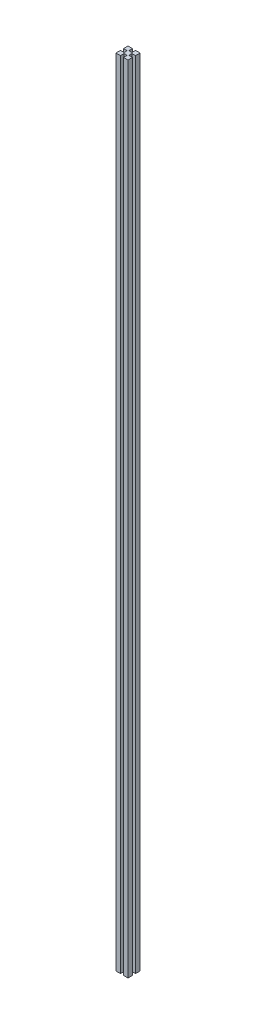
ISO-10303-21;
HEADER;
FILE_DESCRIPTION(('STEP AP214'),'2;1');
FILE_NAME('part.step','',(''),(''),'','','');
FILE_SCHEMA(('AUTOMOTIVE_DESIGN { 1 0 10303 214 1 1 1 1 }'));
ENDSEC;
DATA;
#1=APPLICATION_CONTEXT('core data for automotive mechanical design processes');
#2=APPLICATION_PROTOCOL_DEFINITION('international standard','automotive_design',2000,#1);
#3=PRODUCT_CONTEXT('',#1,'mechanical');
#4=PRODUCT('Part','Part','',(#3));
#5=PRODUCT_RELATED_PRODUCT_CATEGORY('part','',(#4));
#6=PRODUCT_DEFINITION_FORMATION('','',#4);
#7=PRODUCT_DEFINITION_CONTEXT('part definition',#1,'design');
#8=PRODUCT_DEFINITION('design','',#6,#7);
#9=PRODUCT_DEFINITION_SHAPE('','',#8);
#10=(LENGTH_UNIT() NAMED_UNIT(*) SI_UNIT(.MILLI.,.METRE.));
#11=(NAMED_UNIT(*) PLANE_ANGLE_UNIT() SI_UNIT($,.RADIAN.));
#12=(NAMED_UNIT(*) SI_UNIT($,.STERADIAN.) SOLID_ANGLE_UNIT());
#13=UNCERTAINTY_MEASURE_WITH_UNIT(LENGTH_MEASURE(1.E-05),#10,'distance_accuracy_value','');
#14=(GEOMETRIC_REPRESENTATION_CONTEXT(3) GLOBAL_UNCERTAINTY_ASSIGNED_CONTEXT((#13)) GLOBAL_UNIT_ASSIGNED_CONTEXT((#10,
#11,#12)) REPRESENTATION_CONTEXT('',''));
#15=CARTESIAN_POINT('',(0.,0.,0.));
#16=DIRECTION('',(0.,0.,1.));
#17=DIRECTION('',(1.,0.,0.));
#18=AXIS2_PLACEMENT_3D('',#15,#16,#17);
#19=CARTESIAN_POINT('',(10.,-656.463,10.));
#20=DIRECTION('',(1.,0.,0.));
#21=DIRECTION('',(0.,0.,-1.));
#22=AXIS2_PLACEMENT_3D('',#19,#20,#21);
#23=PLANE('',#22);
#24=DIRECTION('',(0.,-1.,0.));
#25=VECTOR('',#24,1.);
#26=CARTESIAN_POINT('',(10.,-656.463,2.5));
#27=LINE('',#26,#25);
#28=CARTESIAN_POINT('',(10.,656.463,2.5));
#29=VERTEX_POINT('',#28);
#30=CARTESIAN_POINT('',(10.,-656.463,2.5));
#31=VERTEX_POINT('',#30);
#32=EDGE_CURVE('E265',#29,#31,#27,.T.);
#33=ORIENTED_EDGE('',*,*,#32,.F.);
#34=DIRECTION('',(0.,0.,-1.));
#35=VECTOR('',#34,1.);
#36=CARTESIAN_POINT('',(10.,656.463,10.));
#37=LINE('',#36,#35);
#38=CARTESIAN_POINT('',(10.,656.463,10.));
#39=VERTEX_POINT('',#38);
#40=EDGE_CURVE('E271',#39,#29,#37,.T.);
#41=ORIENTED_EDGE('',*,*,#40,.F.);
#42=DIRECTION('',(0.,1.,0.));
#43=VECTOR('',#42,1.);
#44=CARTESIAN_POINT('',(10.,-656.463,10.));
#45=LINE('',#44,#43);
#46=CARTESIAN_POINT('',(10.,-656.463,10.));
#47=VERTEX_POINT('',#46);
#48=EDGE_CURVE('E302',#47,#39,#45,.T.);
#49=ORIENTED_EDGE('',*,*,#48,.F.);
#50=DIRECTION('',(0.,0.,-1.));
#51=VECTOR('',#50,1.);
#52=CARTESIAN_POINT('',(10.,-656.463,10.));
#53=LINE('',#52,#51);
#54=EDGE_CURVE('E286',#47,#31,#53,.T.);
#55=ORIENTED_EDGE('',*,*,#54,.T.);
#56=EDGE_LOOP('',(#33,#41,#49,#55));
#57=FACE_BOUND('',#56,.T.);
#58=ADVANCED_FACE('F34',(#57),#23,.T.);
#59=CARTESIAN_POINT('',(-10.,-656.463,10.));
#60=DIRECTION('',(0.,0.,1.));
#61=DIRECTION('',(1.,0.,0.));
#62=AXIS2_PLACEMENT_3D('',#59,#60,#61);
#63=PLANE('',#62);
#64=DIRECTION('',(0.,1.,0.));
#65=VECTOR('',#64,1.);
#66=CARTESIAN_POINT('',(2.5,-656.463,10.));
#67=LINE('',#66,#65);
#68=CARTESIAN_POINT('',(2.5,-656.463,10.));
#69=VERTEX_POINT('',#68);
#70=CARTESIAN_POINT('',(2.5,656.463,10.));
#71=VERTEX_POINT('',#70);
#72=EDGE_CURVE('E258',#69,#71,#67,.T.);
#73=ORIENTED_EDGE('',*,*,#72,.F.);
#74=DIRECTION('',(1.,0.,0.));
#75=VECTOR('',#74,1.);
#76=CARTESIAN_POINT('',(-10.,-656.463,10.));
#77=LINE('',#76,#75);
#78=EDGE_CURVE('E297',#69,#47,#77,.T.);
#79=ORIENTED_EDGE('',*,*,#78,.T.);
#80=ORIENTED_EDGE('',*,*,#48,.T.);
#81=DIRECTION('',(1.,0.,0.));
#82=VECTOR('',#81,1.);
#83=CARTESIAN_POINT('',(-10.,656.463,10.));
#84=LINE('',#83,#82);
#85=EDGE_CURVE('E281',#71,#39,#84,.T.);
#86=ORIENTED_EDGE('',*,*,#85,.F.);
#87=EDGE_LOOP('',(#73,#79,#80,#86));
#88=FACE_BOUND('',#87,.T.);
#89=ADVANCED_FACE('F376',(#88),#63,.T.);
#90=CARTESIAN_POINT('',(-10.,-656.463,10.));
#91=DIRECTION('',(-1.,0.,0.));
#92=DIRECTION('',(0.,0.,1.));
#93=AXIS2_PLACEMENT_3D('',#90,#91,#92);
#94=PLANE('',#93);
#95=DIRECTION('',(0.,-1.,0.));
#96=VECTOR('',#95,1.);
#97=CARTESIAN_POINT('',(-10.,-656.463,-2.5));
#98=LINE('',#97,#96);
#99=CARTESIAN_POINT('',(-10.,656.463,-2.5));
#100=VERTEX_POINT('',#99);
#101=CARTESIAN_POINT('',(-10.,-656.463,-2.5));
#102=VERTEX_POINT('',#101);
#103=EDGE_CURVE('E261',#100,#102,#98,.T.);
#104=ORIENTED_EDGE('',*,*,#103,.F.);
#105=DIRECTION('',(0.,0.,1.));
#106=VECTOR('',#105,1.);
#107=CARTESIAN_POINT('',(-10.,656.463,10.));
#108=LINE('',#107,#106);
#109=CARTESIAN_POINT('',(-10.,656.463,-10.));
#110=VERTEX_POINT('',#109);
#111=EDGE_CURVE('E278',#110,#100,#108,.T.);
#112=ORIENTED_EDGE('',*,*,#111,.F.);
#113=DIRECTION('',(0.,1.,0.));
#114=VECTOR('',#113,1.);
#115=CARTESIAN_POINT('',(-10.,-656.463,-10.));
#116=LINE('',#115,#114);
#117=CARTESIAN_POINT('',(-10.,-656.463,-10.));
#118=VERTEX_POINT('',#117);
#119=EDGE_CURVE('E309',#118,#110,#116,.T.);
#120=ORIENTED_EDGE('',*,*,#119,.F.);
#121=DIRECTION('',(0.,0.,1.));
#122=VECTOR('',#121,1.);
#123=CARTESIAN_POINT('',(-10.,-656.463,10.));
#124=LINE('',#123,#122);
#125=EDGE_CURVE('E294',#118,#102,#124,.T.);
#126=ORIENTED_EDGE('',*,*,#125,.T.);
#127=EDGE_LOOP('',(#104,#112,#120,#126));
#128=FACE_BOUND('',#127,.T.);
#129=ADVANCED_FACE('F346',(#128),#94,.T.);
#130=CARTESIAN_POINT('',(-10.,-656.463,-10.));
#131=DIRECTION('',(0.,0.,-1.));
#132=DIRECTION('',(-1.,0.,0.));
#133=AXIS2_PLACEMENT_3D('',#130,#131,#132);
#134=PLANE('',#133);
#135=DIRECTION('',(0.,-1.,0.));
#136=VECTOR('',#135,1.);
#137=CARTESIAN_POINT('',(2.5,-656.463,-10.));
#138=LINE('',#137,#136);
#139=CARTESIAN_POINT('',(2.5,656.463,-10.));
#140=VERTEX_POINT('',#139);
#141=CARTESIAN_POINT('',(2.5,-656.463,-10.));
#142=VERTEX_POINT('',#141);
#143=EDGE_CURVE('E268',#140,#142,#138,.T.);
#144=ORIENTED_EDGE('',*,*,#143,.F.);
#145=DIRECTION('',(-1.,0.,0.));
#146=VECTOR('',#145,1.);
#147=CARTESIAN_POINT('',(-10.,656.463,-10.));
#148=LINE('',#147,#146);
#149=CARTESIAN_POINT('',(10.,656.463,-10.));
#150=VERTEX_POINT('',#149);
#151=EDGE_CURVE('E275',#150,#140,#148,.T.);
#152=ORIENTED_EDGE('',*,*,#151,.F.);
#153=DIRECTION('',(0.,1.,0.));
#154=VECTOR('',#153,1.);
#155=CARTESIAN_POINT('',(10.,-656.463,-10.));
#156=LINE('',#155,#154);
#157=CARTESIAN_POINT('',(10.,-656.463,-10.));
#158=VERTEX_POINT('',#157);
#159=EDGE_CURVE('E301',#158,#150,#156,.T.);
#160=ORIENTED_EDGE('',*,*,#159,.F.);
#161=DIRECTION('',(-1.,0.,0.));
#162=VECTOR('',#161,1.);
#163=CARTESIAN_POINT('',(-10.,-656.463,-10.));
#164=LINE('',#163,#162);
#165=EDGE_CURVE('E290',#158,#142,#164,.T.);
#166=ORIENTED_EDGE('',*,*,#165,.T.);
#167=EDGE_LOOP('',(#144,#152,#160,#166));
#168=FACE_BOUND('',#167,.T.);
#169=ADVANCED_FACE('F330',(#168),#134,.T.);
#170=DIRECTION('',(0.,1.,0.));
#171=VECTOR('',#170,1.);
#172=CARTESIAN_POINT('',(10.,-656.463,-2.5));
#173=LINE('',#172,#171);
#174=CARTESIAN_POINT('',(10.,-656.463,-2.5));
#175=VERTEX_POINT('',#174);
#176=CARTESIAN_POINT('',(10.,656.463,-2.5));
#177=VERTEX_POINT('',#176);
#178=EDGE_CURVE('E263',#175,#177,#173,.T.);
#179=ORIENTED_EDGE('',*,*,#178,.F.);
#180=EDGE_CURVE('E285',#175,#158,#53,.T.);
#181=ORIENTED_EDGE('',*,*,#180,.T.);
#182=ORIENTED_EDGE('',*,*,#159,.T.);
#183=EDGE_CURVE('E270',#177,#150,#37,.T.);
#184=ORIENTED_EDGE('',*,*,#183,.F.);
#185=EDGE_LOOP('',(#179,#181,#182,#184));
#186=FACE_BOUND('',#185,.T.);
#187=ADVANCED_FACE('F36',(#186),#23,.T.);
#188=DIRECTION('',(0.,-1.,0.));
#189=VECTOR('',#188,1.);
#190=CARTESIAN_POINT('',(-2.5,-656.463,10.));
#191=LINE('',#190,#189);
#192=CARTESIAN_POINT('',(-2.5,656.463,10.));
#193=VERTEX_POINT('',#192);
#194=CARTESIAN_POINT('',(-2.5,-656.463,10.));
#195=VERTEX_POINT('',#194);
#196=EDGE_CURVE('E202',#193,#195,#191,.T.);
#197=ORIENTED_EDGE('',*,*,#196,.F.);
#198=CARTESIAN_POINT('',(-10.,656.463,10.));
#199=VERTEX_POINT('',#198);
#200=EDGE_CURVE('E282',#199,#193,#84,.T.);
#201=ORIENTED_EDGE('',*,*,#200,.F.);
#202=DIRECTION('',(0.,1.,0.));
#203=VECTOR('',#202,1.);
#204=CARTESIAN_POINT('',(-10.,-656.463,10.));
#205=LINE('',#204,#203);
#206=CARTESIAN_POINT('',(-10.,-656.463,10.));
#207=VERTEX_POINT('',#206);
#208=EDGE_CURVE('E306',#207,#199,#205,.T.);
#209=ORIENTED_EDGE('',*,*,#208,.F.);
#210=EDGE_CURVE('E298',#207,#195,#77,.T.);
#211=ORIENTED_EDGE('',*,*,#210,.T.);
#212=EDGE_LOOP('',(#197,#201,#209,#211));
#213=FACE_BOUND('',#212,.T.);
#214=ADVANCED_FACE('F362',(#213),#63,.T.);
#215=DIRECTION('',(0.,1.,0.));
#216=VECTOR('',#215,1.);
#217=CARTESIAN_POINT('',(-10.,-656.463,2.5));
#218=LINE('',#217,#216);
#219=CARTESIAN_POINT('',(-10.,-656.463,2.5));
#220=VERTEX_POINT('',#219);
#221=CARTESIAN_POINT('',(-10.,656.463,2.5));
#222=VERTEX_POINT('',#221);
#223=EDGE_CURVE('E57',#220,#222,#218,.T.);
#224=ORIENTED_EDGE('',*,*,#223,.F.);
#225=EDGE_CURVE('E293',#220,#207,#124,.T.);
#226=ORIENTED_EDGE('',*,*,#225,.T.);
#227=ORIENTED_EDGE('',*,*,#208,.T.);
#228=EDGE_CURVE('E277',#222,#199,#108,.T.);
#229=ORIENTED_EDGE('',*,*,#228,.F.);
#230=EDGE_LOOP('',(#224,#226,#227,#229));
#231=FACE_BOUND('',#230,.T.);
#232=ADVANCED_FACE('F356',(#231),#94,.T.);
#233=DIRECTION('',(0.,1.,0.));
#234=VECTOR('',#233,1.);
#235=CARTESIAN_POINT('',(-2.5,-656.463,-10.));
#236=LINE('',#235,#234);
#237=CARTESIAN_POINT('',(-2.5,-656.463,-10.));
#238=VERTEX_POINT('',#237);
#239=CARTESIAN_POINT('',(-2.5,656.463,-10.));
#240=VERTEX_POINT('',#239);
#241=EDGE_CURVE('E175',#238,#240,#236,.T.);
#242=ORIENTED_EDGE('',*,*,#241,.F.);
#243=EDGE_CURVE('E289',#238,#118,#164,.T.);
#244=ORIENTED_EDGE('',*,*,#243,.T.);
#245=ORIENTED_EDGE('',*,*,#119,.T.);
#246=EDGE_CURVE('E274',#240,#110,#148,.T.);
#247=ORIENTED_EDGE('',*,*,#246,.F.);
#248=EDGE_LOOP('',(#242,#244,#245,#247));
#249=FACE_BOUND('',#248,.T.);
#250=ADVANCED_FACE('F339',(#249),#134,.T.);
#251=CARTESIAN_POINT('',(0.,-656.463,0.));
#252=DIRECTION('',(0.,-1.,0.));
#253=DIRECTION('',(0.,0.,-1.));
#254=AXIS2_PLACEMENT_3D('',#251,#252,#253);
#255=PLANE('',#254);
#256=DIRECTION('',(0.,0.,-1.));
#257=VECTOR('',#256,1.);
#258=CARTESIAN_POINT('',(2.5,-656.463,-4.00000000000001));
#259=LINE('',#258,#257);
#260=CARTESIAN_POINT('',(2.5,-656.463,-4.00000000000001));
#261=VERTEX_POINT('',#260);
#262=EDGE_CURVE('E192',#261,#142,#259,.T.);
#263=ORIENTED_EDGE('',*,*,#262,.T.);
#264=ORIENTED_EDGE('',*,*,#165,.F.);
#265=ORIENTED_EDGE('',*,*,#180,.F.);
#266=DIRECTION('',(-1.,0.,0.));
#267=VECTOR('',#266,1.);
#268=CARTESIAN_POINT('',(4.,-656.463,-2.5));
#269=LINE('',#268,#267);
#270=CARTESIAN_POINT('',(4.,-656.463,-2.5));
#271=VERTEX_POINT('',#270);
#272=EDGE_CURVE('E210',#175,#271,#269,.T.);
#273=ORIENTED_EDGE('',*,*,#272,.T.);
#274=DIRECTION('',(0.,0.,1.));
#275=VECTOR('',#274,1.);
#276=CARTESIAN_POINT('',(4.,-656.463,-2.5));
#277=LINE('',#276,#275);
#278=CARTESIAN_POINT('',(4.,-656.463,2.5));
#279=VERTEX_POINT('',#278);
#280=EDGE_CURVE('E213',#271,#279,#277,.T.);
#281=ORIENTED_EDGE('',*,*,#280,.T.);
#282=DIRECTION('',(1.,0.,0.));
#283=VECTOR('',#282,1.);
#284=CARTESIAN_POINT('',(4.,-656.463,2.5));
#285=LINE('',#284,#283);
#286=EDGE_CURVE('E216',#279,#31,#285,.T.);
#287=ORIENTED_EDGE('',*,*,#286,.T.);
#288=ORIENTED_EDGE('',*,*,#54,.F.);
#289=ORIENTED_EDGE('',*,*,#78,.F.);
#290=DIRECTION('',(0.,0.,-1.));
#291=VECTOR('',#290,1.);
#292=CARTESIAN_POINT('',(2.5,-656.463,4.));
#293=LINE('',#292,#291);
#294=CARTESIAN_POINT('',(2.5,-656.463,4.));
#295=VERTEX_POINT('',#294);
#296=EDGE_CURVE('E251',#69,#295,#293,.T.);
#297=ORIENTED_EDGE('',*,*,#296,.T.);
#298=DIRECTION('',(-1.,0.,0.));
#299=VECTOR('',#298,1.);
#300=CARTESIAN_POINT('',(-2.5,-656.463,4.));
#301=LINE('',#300,#299);
#302=CARTESIAN_POINT('',(-2.5,-656.463,4.));
#303=VERTEX_POINT('',#302);
#304=EDGE_CURVE('E245',#295,#303,#301,.T.);
#305=ORIENTED_EDGE('',*,*,#304,.T.);
#306=DIRECTION('',(0.,0.,1.));
#307=VECTOR('',#306,1.);
#308=CARTESIAN_POINT('',(-2.5,-656.463,4.));
#309=LINE('',#308,#307);
#310=EDGE_CURVE('E248',#303,#195,#309,.T.);
#311=ORIENTED_EDGE('',*,*,#310,.T.);
#312=ORIENTED_EDGE('',*,*,#210,.F.);
#313=ORIENTED_EDGE('',*,*,#225,.F.);
#314=DIRECTION('',(1.,0.,0.));
#315=VECTOR('',#314,1.);
#316=CARTESIAN_POINT('',(-4.00000000000001,-656.463,2.5));
#317=LINE('',#316,#315);
#318=CARTESIAN_POINT('',(-4.00000000000001,-656.463,2.5));
#319=VERTEX_POINT('',#318);
#320=EDGE_CURVE('E232',#220,#319,#317,.T.);
#321=ORIENTED_EDGE('',*,*,#320,.T.);
#322=DIRECTION('',(0.,0.,-1.));
#323=VECTOR('',#322,1.);
#324=CARTESIAN_POINT('',(-4.00000000000001,-656.463,-2.5));
#325=LINE('',#324,#323);
#326=CARTESIAN_POINT('',(-4.00000000000001,-656.463,-2.5));
#327=VERTEX_POINT('',#326);
#328=EDGE_CURVE('E235',#319,#327,#325,.T.);
#329=ORIENTED_EDGE('',*,*,#328,.T.);
#330=DIRECTION('',(-1.,0.,0.));
#331=VECTOR('',#330,1.);
#332=CARTESIAN_POINT('',(-4.00000000000001,-656.463,-2.5));
#333=LINE('',#332,#331);
#334=EDGE_CURVE('E229',#327,#102,#333,.T.);
#335=ORIENTED_EDGE('',*,*,#334,.T.);
#336=ORIENTED_EDGE('',*,*,#125,.F.);
#337=ORIENTED_EDGE('',*,*,#243,.F.);
#338=DIRECTION('',(0.,0.,1.));
#339=VECTOR('',#338,1.);
#340=CARTESIAN_POINT('',(-2.5,-656.463,-4.00000000000001));
#341=LINE('',#340,#339);
#342=CARTESIAN_POINT('',(-2.5,-656.463,-4.00000000000001));
#343=VERTEX_POINT('',#342);
#344=EDGE_CURVE('E195',#238,#343,#341,.T.);
#345=ORIENTED_EDGE('',*,*,#344,.T.);
#346=DIRECTION('',(1.,0.,0.));
#347=VECTOR('',#346,1.);
#348=CARTESIAN_POINT('',(-2.5,-656.463,-4.00000000000001));
#349=LINE('',#348,#347);
#350=EDGE_CURVE('E185',#343,#261,#349,.T.);
#351=ORIENTED_EDGE('',*,*,#350,.T.);
#352=EDGE_LOOP('',(#263,#264,#265,#273,#281,#287,#288,#289,#297,#305,#311,#312,#313,#321,#329,
#335,#336,#337,#345,#351));
#353=FACE_BOUND('',#352,.T.);
#354=ADVANCED_FACE('F335',(#353),#255,.T.);
#355=CARTESIAN_POINT('',(0.,656.463,0.));
#356=DIRECTION('',(0.,-1.,0.));
#357=DIRECTION('',(0.,0.,-1.));
#358=AXIS2_PLACEMENT_3D('',#355,#356,#357);
#359=PLANE('',#358);
#360=ORIENTED_EDGE('',*,*,#151,.T.);
#361=DIRECTION('',(0.,0.,-1.));
#362=VECTOR('',#361,1.);
#363=CARTESIAN_POINT('',(2.5,656.463,-4.00000000000001));
#364=LINE('',#363,#362);
#365=CARTESIAN_POINT('',(2.5,656.463,-4.00000000000001));
#366=VERTEX_POINT('',#365);
#367=EDGE_CURVE('E191',#366,#140,#364,.T.);
#368=ORIENTED_EDGE('',*,*,#367,.F.);
#369=DIRECTION('',(1.,0.,0.));
#370=VECTOR('',#369,1.);
#371=CARTESIAN_POINT('',(-2.5,656.463,-4.00000000000001));
#372=LINE('',#371,#370);
#373=CARTESIAN_POINT('',(-2.5,656.463,-4.00000000000001));
#374=VERTEX_POINT('',#373);
#375=EDGE_CURVE('E182',#374,#366,#372,.T.);
#376=ORIENTED_EDGE('',*,*,#375,.F.);
#377=DIRECTION('',(0.,0.,-1.));
#378=VECTOR('',#377,1.);
#379=CARTESIAN_POINT('',(-2.5,656.463,0.));
#380=LINE('',#379,#378);
#381=EDGE_CURVE('E11',#374,#240,#380,.T.);
#382=ORIENTED_EDGE('',*,*,#381,.T.);
#383=ORIENTED_EDGE('',*,*,#246,.T.);
#384=ORIENTED_EDGE('',*,*,#111,.T.);
#385=DIRECTION('',(-1.,0.,0.));
#386=VECTOR('',#385,1.);
#387=CARTESIAN_POINT('',(-4.00000000000001,656.463,-2.5));
#388=LINE('',#387,#386);
#389=CARTESIAN_POINT('',(-4.00000000000001,656.463,-2.5));
#390=VERTEX_POINT('',#389);
#391=EDGE_CURVE('E223',#390,#100,#388,.T.);
#392=ORIENTED_EDGE('',*,*,#391,.F.);
#393=DIRECTION('',(0.,0.,-1.));
#394=VECTOR('',#393,1.);
#395=CARTESIAN_POINT('',(-4.00000000000001,656.463,-2.5));
#396=LINE('',#395,#394);
#397=CARTESIAN_POINT('',(-4.00000000000001,656.463,2.5));
#398=VERTEX_POINT('',#397);
#399=EDGE_CURVE('E225',#398,#390,#396,.T.);
#400=ORIENTED_EDGE('',*,*,#399,.F.);
#401=DIRECTION('',(-1.,0.,0.));
#402=VECTOR('',#401,1.);
#403=CARTESIAN_POINT('',(0.,656.463,2.5));
#404=LINE('',#403,#402);
#405=EDGE_CURVE('E316',#398,#222,#404,.T.);
#406=ORIENTED_EDGE('',*,*,#405,.T.);
#407=ORIENTED_EDGE('',*,*,#228,.T.);
#408=ORIENTED_EDGE('',*,*,#200,.T.);
#409=DIRECTION('',(0.,0.,1.));
#410=VECTOR('',#409,1.);
#411=CARTESIAN_POINT('',(-2.5,656.463,4.));
#412=LINE('',#411,#410);
#413=CARTESIAN_POINT('',(-2.5,656.463,4.));
#414=VERTEX_POINT('',#413);
#415=EDGE_CURVE('E243',#414,#193,#412,.T.);
#416=ORIENTED_EDGE('',*,*,#415,.F.);
#417=DIRECTION('',(-1.,0.,0.));
#418=VECTOR('',#417,1.);
#419=CARTESIAN_POINT('',(-2.5,656.463,4.));
#420=LINE('',#419,#418);
#421=CARTESIAN_POINT('',(2.5,656.463,4.));
#422=VERTEX_POINT('',#421);
#423=EDGE_CURVE('E49',#422,#414,#420,.T.);
#424=ORIENTED_EDGE('',*,*,#423,.F.);
#425=DIRECTION('',(0.,0.,1.));
#426=VECTOR('',#425,1.);
#427=CARTESIAN_POINT('',(2.5,656.463,0.));
#428=LINE('',#427,#426);
#429=EDGE_CURVE('E305',#422,#71,#428,.T.);
#430=ORIENTED_EDGE('',*,*,#429,.T.);
#431=ORIENTED_EDGE('',*,*,#85,.T.);
#432=ORIENTED_EDGE('',*,*,#40,.T.);
#433=DIRECTION('',(1.,0.,0.));
#434=VECTOR('',#433,1.);
#435=CARTESIAN_POINT('',(4.,656.463,2.5));
#436=LINE('',#435,#434);
#437=CARTESIAN_POINT('',(4.,656.463,2.5));
#438=VERTEX_POINT('',#437);
#439=EDGE_CURVE('E207',#438,#29,#436,.T.);
#440=ORIENTED_EDGE('',*,*,#439,.F.);
#441=DIRECTION('',(0.,0.,1.));
#442=VECTOR('',#441,1.);
#443=CARTESIAN_POINT('',(4.,656.463,-2.5));
#444=LINE('',#443,#442);
#445=CARTESIAN_POINT('',(4.,656.463,-2.5));
#446=VERTEX_POINT('',#445);
#447=EDGE_CURVE('E204',#446,#438,#444,.T.);
#448=ORIENTED_EDGE('',*,*,#447,.F.);
#449=DIRECTION('',(1.,0.,0.));
#450=VECTOR('',#449,1.);
#451=CARTESIAN_POINT('',(0.,656.463,-2.5));
#452=LINE('',#451,#450);
#453=EDGE_CURVE('E42',#446,#177,#452,.T.);
#454=ORIENTED_EDGE('',*,*,#453,.T.);
#455=ORIENTED_EDGE('',*,*,#183,.T.);
#456=EDGE_LOOP('',(#360,#368,#376,#382,#383,#384,#392,#400,#406,#407,#408,#416,#424,#430,#431,
#432,#440,#448,#454,#455));
#457=FACE_BOUND('',#456,.T.);
#458=ADVANCED_FACE('F190',(#457),#359,.F.);
#459=CARTESIAN_POINT('',(-2.5,-656.463,4.));
#460=DIRECTION('',(0.,0.,-1.));
#461=DIRECTION('',(-1.,0.,0.));
#462=AXIS2_PLACEMENT_3D('',#459,#460,#461);
#463=PLANE('',#462);
#464=DIRECTION('',(0.,1.,0.));
#465=VECTOR('',#464,1.);
#466=CARTESIAN_POINT('',(-2.5,-656.463,4.));
#467=LINE('',#466,#465);
#468=EDGE_CURVE('E254',#303,#414,#467,.T.);
#469=ORIENTED_EDGE('',*,*,#468,.F.);
#470=ORIENTED_EDGE('',*,*,#304,.F.);
#471=DIRECTION('',(0.,1.,0.));
#472=VECTOR('',#471,1.);
#473=CARTESIAN_POINT('',(2.5,-656.463,4.));
#474=LINE('',#473,#472);
#475=EDGE_CURVE('E226',#295,#422,#474,.T.);
#476=ORIENTED_EDGE('',*,*,#475,.T.);
#477=ORIENTED_EDGE('',*,*,#423,.T.);
#478=EDGE_LOOP('',(#469,#470,#476,#477));
#479=FACE_BOUND('',#478,.T.);
#480=ADVANCED_FACE('F368',(#479),#463,.F.);
#481=CARTESIAN_POINT('',(2.5,-656.463,4.));
#482=DIRECTION('',(1.,0.,0.));
#483=DIRECTION('',(0.,0.,-1.));
#484=AXIS2_PLACEMENT_3D('',#481,#482,#483);
#485=PLANE('',#484);
#486=ORIENTED_EDGE('',*,*,#72,.T.);
#487=ORIENTED_EDGE('',*,*,#429,.F.);
#488=ORIENTED_EDGE('',*,*,#475,.F.);
#489=ORIENTED_EDGE('',*,*,#296,.F.);
#490=EDGE_LOOP('',(#486,#487,#488,#489));
#491=FACE_BOUND('',#490,.T.);
#492=ADVANCED_FACE('F373',(#491),#485,.F.);
#493=CARTESIAN_POINT('',(-2.5,-656.463,4.));
#494=DIRECTION('',(-1.,0.,0.));
#495=DIRECTION('',(0.,0.,1.));
#496=AXIS2_PLACEMENT_3D('',#493,#494,#495);
#497=PLANE('',#496);
#498=ORIENTED_EDGE('',*,*,#196,.T.);
#499=ORIENTED_EDGE('',*,*,#310,.F.);
#500=ORIENTED_EDGE('',*,*,#468,.T.);
#501=ORIENTED_EDGE('',*,*,#415,.T.);
#502=EDGE_LOOP('',(#498,#499,#500,#501));
#503=FACE_BOUND('',#502,.T.);
#504=ADVANCED_FACE('F365',(#503),#497,.F.);
#505=CARTESIAN_POINT('',(-4.00000000000001,-656.463,-2.5));
#506=DIRECTION('',(0.,0.,-1.));
#507=DIRECTION('',(-1.,0.,0.));
#508=AXIS2_PLACEMENT_3D('',#505,#506,#507);
#509=PLANE('',#508);
#510=ORIENTED_EDGE('',*,*,#103,.T.);
#511=ORIENTED_EDGE('',*,*,#334,.F.);
#512=DIRECTION('',(0.,1.,0.));
#513=VECTOR('',#512,1.);
#514=CARTESIAN_POINT('',(-4.00000000000001,-656.463,-2.5));
#515=LINE('',#514,#513);
#516=EDGE_CURVE('E208',#327,#390,#515,.T.);
#517=ORIENTED_EDGE('',*,*,#516,.T.);
#518=ORIENTED_EDGE('',*,*,#391,.T.);
#519=EDGE_LOOP('',(#510,#511,#517,#518));
#520=FACE_BOUND('',#519,.T.);
#521=ADVANCED_FACE('F349',(#520),#509,.F.);
#522=CARTESIAN_POINT('',(-4.00000000000001,-656.463,-2.5));
#523=DIRECTION('',(1.,0.,0.));
#524=DIRECTION('',(0.,0.,-1.));
#525=AXIS2_PLACEMENT_3D('',#522,#523,#524);
#526=PLANE('',#525);
#527=ORIENTED_EDGE('',*,*,#516,.F.);
#528=ORIENTED_EDGE('',*,*,#328,.F.);
#529=DIRECTION('',(0.,1.,0.));
#530=VECTOR('',#529,1.);
#531=CARTESIAN_POINT('',(-4.00000000000001,-656.463,2.5));
#532=LINE('',#531,#530);
#533=EDGE_CURVE('E238',#319,#398,#532,.T.);
#534=ORIENTED_EDGE('',*,*,#533,.T.);
#535=ORIENTED_EDGE('',*,*,#399,.T.);
#536=EDGE_LOOP('',(#527,#528,#534,#535));
#537=FACE_BOUND('',#536,.T.);
#538=ADVANCED_FACE('F353',(#537),#526,.F.);
#539=CARTESIAN_POINT('',(-4.00000000000001,-656.463,2.5));
#540=DIRECTION('',(0.,0.,1.));
#541=DIRECTION('',(1.,0.,0.));
#542=AXIS2_PLACEMENT_3D('',#539,#540,#541);
#543=PLANE('',#542);
#544=ORIENTED_EDGE('',*,*,#223,.T.);
#545=ORIENTED_EDGE('',*,*,#405,.F.);
#546=ORIENTED_EDGE('',*,*,#533,.F.);
#547=ORIENTED_EDGE('',*,*,#320,.F.);
#548=EDGE_LOOP('',(#544,#545,#546,#547));
#549=FACE_BOUND('',#548,.T.);
#550=ADVANCED_FACE('F430',(#549),#543,.F.);
#551=CARTESIAN_POINT('',(4.,-656.463,2.5));
#552=DIRECTION('',(0.,0.,1.));
#553=DIRECTION('',(1.,0.,0.));
#554=AXIS2_PLACEMENT_3D('',#551,#552,#553);
#555=PLANE('',#554);
#556=ORIENTED_EDGE('',*,*,#32,.T.);
#557=ORIENTED_EDGE('',*,*,#286,.F.);
#558=DIRECTION('',(0.,1.,0.));
#559=VECTOR('',#558,1.);
#560=CARTESIAN_POINT('',(4.,-656.463,2.5));
#561=LINE('',#560,#559);
#562=EDGE_CURVE('E197',#279,#438,#561,.T.);
#563=ORIENTED_EDGE('',*,*,#562,.T.);
#564=ORIENTED_EDGE('',*,*,#439,.T.);
#565=EDGE_LOOP('',(#556,#557,#563,#564));
#566=FACE_BOUND('',#565,.T.);
#567=ADVANCED_FACE('F383',(#566),#555,.F.);
#568=CARTESIAN_POINT('',(4.,-656.463,-2.5));
#569=DIRECTION('',(-1.,0.,0.));
#570=DIRECTION('',(0.,0.,1.));
#571=AXIS2_PLACEMENT_3D('',#568,#569,#570);
#572=PLANE('',#571);
#573=ORIENTED_EDGE('',*,*,#562,.F.);
#574=ORIENTED_EDGE('',*,*,#280,.F.);
#575=DIRECTION('',(0.,1.,0.));
#576=VECTOR('',#575,1.);
#577=CARTESIAN_POINT('',(4.,-656.463,-2.5));
#578=LINE('',#577,#576);
#579=EDGE_CURVE('E219',#271,#446,#578,.T.);
#580=ORIENTED_EDGE('',*,*,#579,.T.);
#581=ORIENTED_EDGE('',*,*,#447,.T.);
#582=EDGE_LOOP('',(#573,#574,#580,#581));
#583=FACE_BOUND('',#582,.T.);
#584=ADVANCED_FACE('F386',(#583),#572,.F.);
#585=CARTESIAN_POINT('',(4.,-656.463,-2.5));
#586=DIRECTION('',(0.,0.,-1.));
#587=DIRECTION('',(-1.,0.,0.));
#588=AXIS2_PLACEMENT_3D('',#585,#586,#587);
#589=PLANE('',#588);
#590=ORIENTED_EDGE('',*,*,#178,.T.);
#591=ORIENTED_EDGE('',*,*,#453,.F.);
#592=ORIENTED_EDGE('',*,*,#579,.F.);
#593=ORIENTED_EDGE('',*,*,#272,.F.);
#594=EDGE_LOOP('',(#590,#591,#592,#593));
#595=FACE_BOUND('',#594,.T.);
#596=ADVANCED_FACE('F387',(#595),#589,.F.);
#597=CARTESIAN_POINT('',(2.5,-656.463,-4.00000000000001));
#598=DIRECTION('',(1.,0.,0.));
#599=DIRECTION('',(0.,0.,-1.));
#600=AXIS2_PLACEMENT_3D('',#597,#598,#599);
#601=PLANE('',#600);
#602=ORIENTED_EDGE('',*,*,#143,.T.);
#603=ORIENTED_EDGE('',*,*,#262,.F.);
#604=DIRECTION('',(0.,1.,0.));
#605=VECTOR('',#604,1.);
#606=CARTESIAN_POINT('',(2.5,-656.463,-4.00000000000001));
#607=LINE('',#606,#605);
#608=EDGE_CURVE('E187',#261,#366,#607,.T.);
#609=ORIENTED_EDGE('',*,*,#608,.T.);
#610=ORIENTED_EDGE('',*,*,#367,.T.);
#611=EDGE_LOOP('',(#602,#603,#609,#610));
#612=FACE_BOUND('',#611,.T.);
#613=ADVANCED_FACE('F333',(#612),#601,.F.);
#614=CARTESIAN_POINT('',(-2.5,-656.463,-4.00000000000001));
#615=DIRECTION('',(0.,0.,1.));
#616=DIRECTION('',(1.,0.,0.));
#617=AXIS2_PLACEMENT_3D('',#614,#615,#616);
#618=PLANE('',#617);
#619=ORIENTED_EDGE('',*,*,#608,.F.);
#620=ORIENTED_EDGE('',*,*,#350,.F.);
#621=DIRECTION('',(0.,1.,0.));
#622=VECTOR('',#621,1.);
#623=CARTESIAN_POINT('',(-2.5,-656.463,-4.00000000000001));
#624=LINE('',#623,#622);
#625=EDGE_CURVE('E172',#343,#374,#624,.T.);
#626=ORIENTED_EDGE('',*,*,#625,.T.);
#627=ORIENTED_EDGE('',*,*,#375,.T.);
#628=EDGE_LOOP('',(#619,#620,#626,#627));
#629=FACE_BOUND('',#628,.T.);
#630=ADVANCED_FACE('F181',(#629),#618,.F.);
#631=CARTESIAN_POINT('',(-2.5,-656.463,-4.00000000000001));
#632=DIRECTION('',(-1.,0.,0.));
#633=DIRECTION('',(0.,0.,1.));
#634=AXIS2_PLACEMENT_3D('',#631,#632,#633);
#635=PLANE('',#634);
#636=ORIENTED_EDGE('',*,*,#241,.T.);
#637=ORIENTED_EDGE('',*,*,#381,.F.);
#638=ORIENTED_EDGE('',*,*,#625,.F.);
#639=ORIENTED_EDGE('',*,*,#344,.F.);
#640=EDGE_LOOP('',(#636,#637,#638,#639));
#641=FACE_BOUND('',#640,.T.);
#642=ADVANCED_FACE('F171',(#641),#635,.F.);
#643=CLOSED_SHELL('',(#58,#89,#129,#169,#187,#214,#232,#250,#354,#458,#480,#492,#504,#521,#538,
#550,#567,#584,#596,#613,#630,#642));
#644=MANIFOLD_SOLID_BREP('B2',#643);
#645=ADVANCED_BREP_SHAPE_REPRESENTATION('',(#18,#644),#14);
#646=SHAPE_DEFINITION_REPRESENTATION(#9,#645);
ENDSEC;
END-ISO-10303-21;
